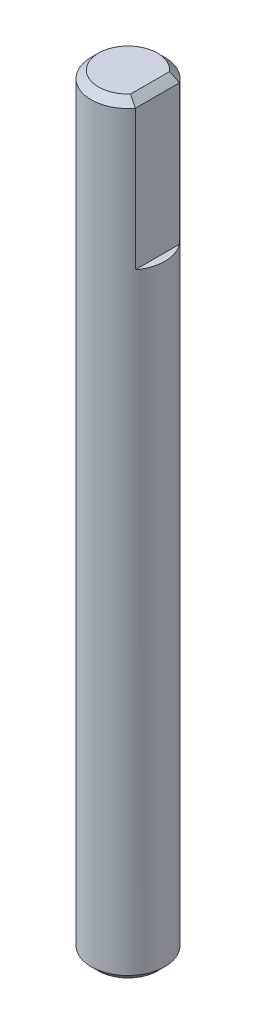
ISO-10303-21;
HEADER;
FILE_DESCRIPTION(('STEP AP214'),'2;1');
FILE_NAME('part.step','',(''),(''),'','','');
FILE_SCHEMA(('AUTOMOTIVE_DESIGN { 1 0 10303 214 1 1 1 1 }'));
ENDSEC;
DATA;
#1=APPLICATION_CONTEXT('core data for automotive mechanical design processes');
#2=APPLICATION_PROTOCOL_DEFINITION('international standard','automotive_design',2000,#1);
#3=PRODUCT_CONTEXT('',#1,'mechanical');
#4=PRODUCT('Part','Part','',(#3));
#5=PRODUCT_RELATED_PRODUCT_CATEGORY('part','',(#4));
#6=PRODUCT_DEFINITION_FORMATION('','',#4);
#7=PRODUCT_DEFINITION_CONTEXT('part definition',#1,'design');
#8=PRODUCT_DEFINITION('design','',#6,#7);
#9=PRODUCT_DEFINITION_SHAPE('','',#8);
#10=(LENGTH_UNIT() NAMED_UNIT(*) SI_UNIT(.MILLI.,.METRE.));
#11=(NAMED_UNIT(*) PLANE_ANGLE_UNIT() SI_UNIT($,.RADIAN.));
#12=(NAMED_UNIT(*) SI_UNIT($,.STERADIAN.) SOLID_ANGLE_UNIT());
#13=UNCERTAINTY_MEASURE_WITH_UNIT(LENGTH_MEASURE(1.E-05),#10,'distance_accuracy_value','');
#14=(GEOMETRIC_REPRESENTATION_CONTEXT(3) GLOBAL_UNCERTAINTY_ASSIGNED_CONTEXT((#13)) GLOBAL_UNIT_ASSIGNED_CONTEXT((#10,
#11,#12)) REPRESENTATION_CONTEXT('',''));
#15=CARTESIAN_POINT('',(0.,0.,0.));
#16=DIRECTION('',(0.,0.,1.));
#17=DIRECTION('',(1.,0.,0.));
#18=AXIS2_PLACEMENT_3D('',#15,#16,#17);
#19=CARTESIAN_POINT('',(0.,26.,0.));
#20=DIRECTION('',(0.,-1.,0.));
#21=DIRECTION('',(0.,0.,-1.));
#22=AXIS2_PLACEMENT_3D('',#19,#20,#21);
#23=CYLINDRICAL_SURFACE('',#22,2.5);
#24=CARTESIAN_POINT('',(0.,-25.5,0.));
#25=DIRECTION('',(0.,1.,0.));
#26=DIRECTION('',(0.,0.,1.));
#27=AXIS2_PLACEMENT_3D('',#24,#25,#26);
#28=CIRCLE('',#27,2.5);
#29=CARTESIAN_POINT('',(0.,-25.5,2.5));
#30=VERTEX_POINT('',#29);
#31=EDGE_CURVE('E99',#30,#30,#28,.T.);
#32=ORIENTED_EDGE('',*,*,#31,.T.);
#33=EDGE_LOOP('',(#32));
#34=FACE_BOUND('',#33,.T.);
#35=DIRECTION('',(0.,-1.,0.));
#36=VECTOR('',#35,1.);
#37=CARTESIAN_POINT('',(2.,26.,1.5));
#38=LINE('',#37,#36);
#39=CARTESIAN_POINT('',(2.,16.,1.5));
#40=VERTEX_POINT('',#39);
#41=CARTESIAN_POINT('',(2.,25.5,1.5));
#42=VERTEX_POINT('',#41);
#43=EDGE_CURVE('E81',#40,#42,#38,.F.);
#44=ORIENTED_EDGE('',*,*,#43,.T.);
#45=CARTESIAN_POINT('',(0.,25.5,0.));
#46=DIRECTION('',(0.,1.,0.));
#47=DIRECTION('',(0.,0.,1.));
#48=AXIS2_PLACEMENT_3D('',#45,#46,#47);
#49=CIRCLE('',#48,2.5);
#50=CARTESIAN_POINT('',(2.,25.5,-1.5));
#51=VERTEX_POINT('',#50);
#52=EDGE_CURVE('E97',#42,#51,#49,.F.);
#53=ORIENTED_EDGE('',*,*,#52,.T.);
#54=DIRECTION('',(0.,-1.,0.));
#55=VECTOR('',#54,1.);
#56=CARTESIAN_POINT('',(2.,26.,-1.5));
#57=LINE('',#56,#55);
#58=CARTESIAN_POINT('',(2.,16.,-1.5));
#59=VERTEX_POINT('',#58);
#60=EDGE_CURVE('E90',#51,#59,#57,.T.);
#61=ORIENTED_EDGE('',*,*,#60,.T.);
#62=CARTESIAN_POINT('',(0.,16.,0.));
#63=DIRECTION('',(0.,1.,0.));
#64=DIRECTION('',(0.,0.,1.));
#65=AXIS2_PLACEMENT_3D('',#62,#63,#64);
#66=CIRCLE('',#65,2.5);
#67=EDGE_CURVE('E95',#40,#59,#66,.T.);
#68=ORIENTED_EDGE('',*,*,#67,.F.);
#69=EDGE_LOOP('',(#44,#53,#61,#68));
#70=FACE_BOUND('',#69,.T.);
#71=ADVANCED_FACE('F37',(#34,#70),#23,.T.);
#72=CARTESIAN_POINT('',(0.,26.,0.));
#73=DIRECTION('',(0.,1.,0.));
#74=DIRECTION('',(0.,0.,1.));
#75=AXIS2_PLACEMENT_3D('',#72,#73,#74);
#76=PLANE('',#75);
#77=DIRECTION('',(0.,0.,-1.));
#78=VECTOR('',#77,1.);
#79=CARTESIAN_POINT('',(1.5,26.,-1.5));
#80=LINE('',#79,#78);
#81=CARTESIAN_POINT('',(1.5,26.,1.3228756555323));
#82=VERTEX_POINT('',#81);
#83=CARTESIAN_POINT('',(1.5,26.,-1.3228756555323));
#84=VERTEX_POINT('',#83);
#85=EDGE_CURVE('E59',#82,#84,#80,.T.);
#86=ORIENTED_EDGE('',*,*,#85,.T.);
#87=CARTESIAN_POINT('',(0.,26.,0.));
#88=DIRECTION('',(0.,1.,0.));
#89=DIRECTION('',(0.,0.,1.));
#90=AXIS2_PLACEMENT_3D('',#87,#88,#89);
#91=CIRCLE('',#90,2.);
#92=EDGE_CURVE('E52',#84,#82,#91,.T.);
#93=ORIENTED_EDGE('',*,*,#92,.T.);
#94=EDGE_LOOP('',(#86,#93));
#95=FACE_BOUND('',#94,.T.);
#96=ADVANCED_FACE('F131',(#95),#76,.T.);
#97=CARTESIAN_POINT('',(0.,-26.,0.));
#98=DIRECTION('',(0.,1.,0.));
#99=DIRECTION('',(0.,0.,1.));
#100=AXIS2_PLACEMENT_3D('',#97,#98,#99);
#101=PLANE('',#100);
#102=CARTESIAN_POINT('',(0.,-26.,0.));
#103=DIRECTION('',(0.,1.,0.));
#104=DIRECTION('',(0.,0.,1.));
#105=AXIS2_PLACEMENT_3D('',#102,#103,#104);
#106=CIRCLE('',#105,1.99999999999996);
#107=CARTESIAN_POINT('',(0.,-26.,1.99999999999996));
#108=VERTEX_POINT('',#107);
#109=EDGE_CURVE('E105',#108,#108,#106,.F.);
#110=ORIENTED_EDGE('',*,*,#109,.T.);
#111=EDGE_LOOP('',(#110));
#112=FACE_BOUND('',#111,.T.);
#113=ADVANCED_FACE('F133',(#112),#101,.F.);
#114=CARTESIAN_POINT('',(54.,16.,6.9864473846132));
#115=DIRECTION('',(0.,1.,0.));
#116=DIRECTION('',(0.,0.,1.));
#117=AXIS2_PLACEMENT_3D('',#114,#115,#116);
#118=PLANE('',#117);
#119=ORIENTED_EDGE('',*,*,#67,.T.);
#120=DIRECTION('',(0.,0.,-1.));
#121=VECTOR('',#120,1.);
#122=CARTESIAN_POINT('',(2.,16.,6.9864473846132));
#123=LINE('',#122,#121);
#124=EDGE_CURVE('E85',#40,#59,#123,.T.);
#125=ORIENTED_EDGE('',*,*,#124,.F.);
#126=EDGE_LOOP('',(#119,#125));
#127=FACE_BOUND('',#126,.T.);
#128=ADVANCED_FACE('F94',(#127),#118,.T.);
#129=CARTESIAN_POINT('',(2.,0.,0.));
#130=DIRECTION('',(-1.,0.,0.));
#131=DIRECTION('',(0.,0.,1.));
#132=AXIS2_PLACEMENT_3D('',#129,#130,#131);
#133=PLANE('',#132);
#134=ORIENTED_EDGE('',*,*,#60,.F.);
#135=DIRECTION('',(0.,0.,1.));
#136=VECTOR('',#135,1.);
#137=CARTESIAN_POINT('',(2.,25.5,1.5));
#138=LINE('',#137,#136);
#139=EDGE_CURVE('E11',#51,#42,#138,.T.);
#140=ORIENTED_EDGE('',*,*,#139,.T.);
#141=ORIENTED_EDGE('',*,*,#43,.F.);
#142=ORIENTED_EDGE('',*,*,#124,.T.);
#143=EDGE_LOOP('',(#134,#140,#141,#142));
#144=FACE_BOUND('',#143,.T.);
#145=ADVANCED_FACE('F84',(#144),#133,.F.);
#146=CARTESIAN_POINT('',(0.,-25.5,0.));
#147=DIRECTION('',(0.,1.,0.));
#148=DIRECTION('',(0.,0.,1.));
#149=AXIS2_PLACEMENT_3D('',#146,#147,#148);
#150=CONICAL_SURFACE('',#149,2.5,0.785398163397453);
#151=ORIENTED_EDGE('',*,*,#109,.F.);
#152=EDGE_LOOP('',(#151));
#153=FACE_BOUND('',#152,.T.);
#154=ORIENTED_EDGE('',*,*,#31,.F.);
#155=EDGE_LOOP('',(#154));
#156=FACE_BOUND('',#155,.T.);
#157=ADVANCED_FACE('F120',(#153,#156),#150,.T.);
#158=CARTESIAN_POINT('',(2.,25.5,0.));
#159=DIRECTION('',(0.707106781186547,0.707106781186547,0.));
#160=DIRECTION('',(0.,0.,-1.));
#161=AXIS2_PLACEMENT_3D('',#158,#159,#160);
#162=PLANE('',#161);
#163=CARTESIAN_POINT('',(1.5,26.,1.3228756555323));
#164=CARTESIAN_POINT('',(1.54150083606693,25.9584991639331,1.33856024136969));
#165=CARTESIAN_POINT('',(1.58305016231495,25.9169498376851,1.35398671696421));
#166=CARTESIAN_POINT('',(1.66623321654463,25.8337667834554,1.38436438703584));
#167=CARTESIAN_POINT('',(1.7078669397876,25.7921330602124,1.39931560745198));
#168=CARTESIAN_POINT('',(1.79121014299889,25.7087898570011,1.42878519796258));
#169=CARTESIAN_POINT('',(1.83291962185564,25.6670803781444,1.44330357435469));
#170=CARTESIAN_POINT('',(1.91640930794319,25.5835906920568,1.47194219050032));
#171=CARTESIAN_POINT('',(1.95818951891394,25.5418104810861,1.48606240845706));
#172=CARTESIAN_POINT('',(2.,25.5,1.5));
#173=B_SPLINE_CURVE_WITH_KNOTS('',3,(#163,#164,#165,#166,#167,#168,#169,#170,#171,#172),
.UNSPECIFIED.,.F.,.F.,(4,2,2,2,4),(0.,0.182250890874288,0.364491817508491,0.546730091336229,
0.728978322325578),.UNSPECIFIED.);
#174=EDGE_CURVE('E67',#42,#82,#173,.F.);
#175=ORIENTED_EDGE('',*,*,#174,.F.);
#176=ORIENTED_EDGE('',*,*,#139,.F.);
#177=CARTESIAN_POINT('',(2.,25.5,-1.5));
#178=CARTESIAN_POINT('',(1.95818951891394,25.5418104810861,-1.48606240845706));
#179=CARTESIAN_POINT('',(1.91640930794319,25.5835906920568,-1.47194219050032));
#180=CARTESIAN_POINT('',(1.83291962185564,25.6670803781444,-1.44330357435469));
#181=CARTESIAN_POINT('',(1.79121014299889,25.7087898570011,-1.42878519796258));
#182=CARTESIAN_POINT('',(1.7078669397876,25.7921330602124,-1.39931560745198));
#183=CARTESIAN_POINT('',(1.66623321654463,25.8337667834554,-1.38436438703584));
#184=CARTESIAN_POINT('',(1.58305016231495,25.9169498376851,-1.35398671696421));
#185=CARTESIAN_POINT('',(1.54150083606693,25.9584991639331,-1.33856024136969));
#186=CARTESIAN_POINT('',(1.5,26.,-1.32287565553229));
#187=B_SPLINE_CURVE_WITH_KNOTS('',3,(#177,#178,#179,#180,#181,#182,#183,#184,#185,#186),
.UNSPECIFIED.,.F.,.F.,(4,2,2,2,4),(0.,0.182248230989354,0.364486504817088,0.546727431451291,
0.728978322325579),.UNSPECIFIED.);
#188=EDGE_CURVE('E43',#84,#51,#187,.F.);
#189=ORIENTED_EDGE('',*,*,#188,.F.);
#190=ORIENTED_EDGE('',*,*,#85,.F.);
#191=EDGE_LOOP('',(#175,#176,#189,#190));
#192=FACE_BOUND('',#191,.T.);
#193=ADVANCED_FACE('F114',(#192),#162,.T.);
#194=CARTESIAN_POINT('',(0.,26.,0.));
#195=DIRECTION('',(0.,-1.,0.));
#196=DIRECTION('',(0.,0.,-1.));
#197=AXIS2_PLACEMENT_3D('',#194,#195,#196);
#198=CONICAL_SURFACE('',#197,2.,0.785398163397448);
#199=ORIENTED_EDGE('',*,*,#188,.T.);
#200=ORIENTED_EDGE('',*,*,#52,.F.);
#201=ORIENTED_EDGE('',*,*,#174,.T.);
#202=ORIENTED_EDGE('',*,*,#92,.F.);
#203=EDGE_LOOP('',(#199,#200,#201,#202));
#204=FACE_BOUND('',#203,.T.);
#205=ADVANCED_FACE('F40',(#204),#198,.T.);
#206=CLOSED_SHELL('',(#71,#96,#113,#128,#145,#157,#193,#205));
#207=MANIFOLD_SOLID_BREP('B2',#206);
#208=ADVANCED_BREP_SHAPE_REPRESENTATION('',(#18,#207),#14);
#209=SHAPE_DEFINITION_REPRESENTATION(#9,#208);
ENDSEC;
END-ISO-10303-21;
